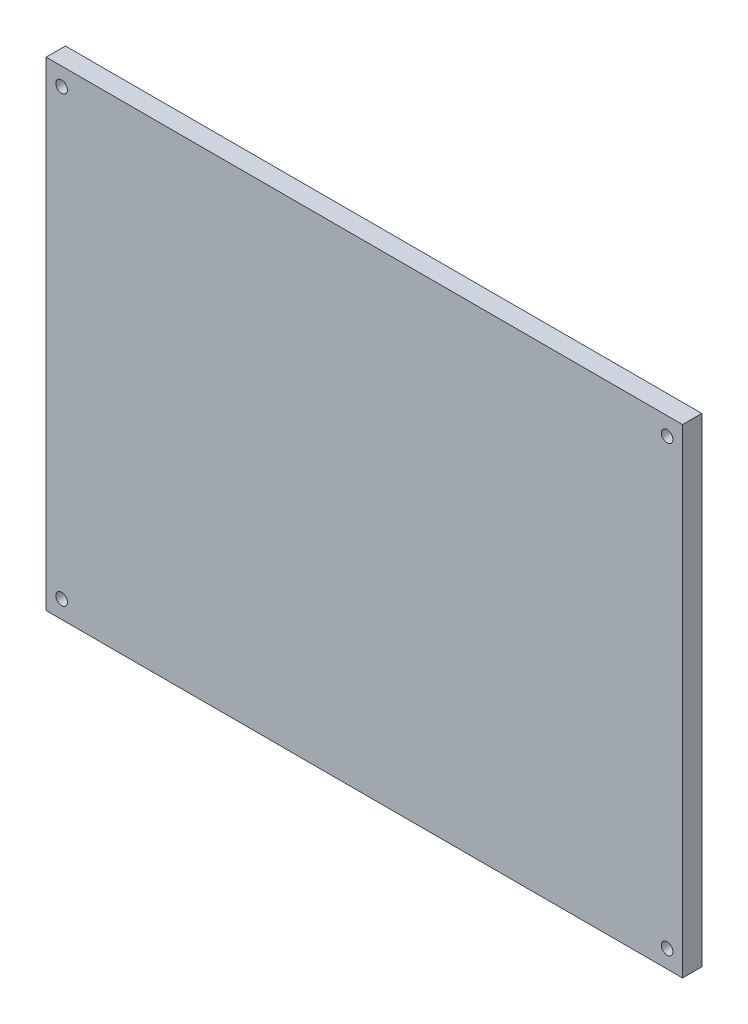
ISO-10303-21;
HEADER;
FILE_DESCRIPTION(('STEP AP214'),'2;1');
FILE_NAME('part.step','',(''),(''),'','','');
FILE_SCHEMA(('AUTOMOTIVE_DESIGN { 1 0 10303 214 1 1 1 1 }'));
ENDSEC;
DATA;
#1=APPLICATION_CONTEXT('core data for automotive mechanical design processes');
#2=APPLICATION_PROTOCOL_DEFINITION('international standard','automotive_design',2000,#1);
#3=PRODUCT_CONTEXT('',#1,'mechanical');
#4=PRODUCT('Part','Part','',(#3));
#5=PRODUCT_RELATED_PRODUCT_CATEGORY('part','',(#4));
#6=PRODUCT_DEFINITION_FORMATION('','',#4);
#7=PRODUCT_DEFINITION_CONTEXT('part definition',#1,'design');
#8=PRODUCT_DEFINITION('design','',#6,#7);
#9=PRODUCT_DEFINITION_SHAPE('','',#8);
#10=(LENGTH_UNIT() NAMED_UNIT(*) SI_UNIT(.MILLI.,.METRE.));
#11=(NAMED_UNIT(*) PLANE_ANGLE_UNIT() SI_UNIT($,.RADIAN.));
#12=(NAMED_UNIT(*) SI_UNIT($,.STERADIAN.) SOLID_ANGLE_UNIT());
#13=UNCERTAINTY_MEASURE_WITH_UNIT(LENGTH_MEASURE(1.E-05),#10,'distance_accuracy_value','');
#14=(GEOMETRIC_REPRESENTATION_CONTEXT(3) GLOBAL_UNCERTAINTY_ASSIGNED_CONTEXT((#13)) GLOBAL_UNIT_ASSIGNED_CONTEXT((#10,
#11,#12)) REPRESENTATION_CONTEXT('',''));
#15=CARTESIAN_POINT('',(0.,0.,0.));
#16=DIRECTION('',(0.,0.,1.));
#17=DIRECTION('',(1.,0.,0.));
#18=AXIS2_PLACEMENT_3D('',#15,#16,#17);
#19=CARTESIAN_POINT('',(0.,0.,0.));
#20=DIRECTION('',(0.,0.,1.));
#21=DIRECTION('',(1.,0.,0.));
#22=AXIS2_PLACEMENT_3D('',#19,#20,#21);
#23=PLANE('',#22);
#24=CARTESIAN_POINT('',(-78.45,-57.48,0.));
#25=DIRECTION('',(0.,0.,1.));
#26=DIRECTION('',(1.,0.,0.));
#27=AXIS2_PLACEMENT_3D('',#24,#25,#26);
#28=CIRCLE('',#27,1.5);
#29=CARTESIAN_POINT('',(-76.95,-57.48,0.));
#30=VERTEX_POINT('',#29);
#31=EDGE_CURVE('E364',#30,#30,#28,.F.);
#32=ORIENTED_EDGE('',*,*,#31,.F.);
#33=EDGE_LOOP('',(#32));
#34=FACE_BOUND('',#33,.T.);
#35=CARTESIAN_POINT('',(78.45,-57.48,0.));
#36=DIRECTION('',(0.,0.,1.));
#37=DIRECTION('',(1.,0.,0.));
#38=AXIS2_PLACEMENT_3D('',#35,#36,#37);
#39=CIRCLE('',#38,1.5);
#40=CARTESIAN_POINT('',(79.95,-57.48,0.));
#41=VERTEX_POINT('',#40);
#42=EDGE_CURVE('E368',#41,#41,#39,.T.);
#43=ORIENTED_EDGE('',*,*,#42,.T.);
#44=EDGE_LOOP('',(#43));
#45=FACE_BOUND('',#44,.T.);
#46=CARTESIAN_POINT('',(78.45,57.48,0.));
#47=DIRECTION('',(0.,0.,1.));
#48=DIRECTION('',(1.,0.,0.));
#49=AXIS2_PLACEMENT_3D('',#46,#47,#48);
#50=CIRCLE('',#49,1.5);
#51=CARTESIAN_POINT('',(79.95,57.48,0.));
#52=VERTEX_POINT('',#51);
#53=EDGE_CURVE('E377',#52,#52,#50,.F.);
#54=ORIENTED_EDGE('',*,*,#53,.F.);
#55=EDGE_LOOP('',(#54));
#56=FACE_BOUND('',#55,.T.);
#57=DIRECTION('',(-1.,0.,0.));
#58=VECTOR('',#57,1.);
#59=CARTESIAN_POINT('',(1.5,14.0181764613353,0.));
#60=LINE('',#59,#58);
#61=CARTESIAN_POINT('',(4.5,14.0181764613353,0.));
#62=VERTEX_POINT('',#61);
#63=CARTESIAN_POINT('',(1.5,14.0181764613353,0.));
#64=VERTEX_POINT('',#63);
#65=EDGE_CURVE('E212',#62,#64,#60,.T.);
#66=ORIENTED_EDGE('',*,*,#65,.T.);
#67=DIRECTION('',(0.,-1.,0.));
#68=VECTOR('',#67,1.);
#69=CARTESIAN_POINT('',(1.5,6.,0.));
#70=LINE('',#69,#68);
#71=CARTESIAN_POINT('',(1.5,-14.0181764613353,0.));
#72=VERTEX_POINT('',#71);
#73=EDGE_CURVE('E255',#64,#72,#70,.T.);
#74=ORIENTED_EDGE('',*,*,#73,.T.);
#75=DIRECTION('',(1.,0.,0.));
#76=VECTOR('',#75,1.);
#77=CARTESIAN_POINT('',(4.5,-14.0181764613353,0.));
#78=LINE('',#77,#76);
#79=CARTESIAN_POINT('',(4.5,-14.0181764613353,0.));
#80=VERTEX_POINT('',#79);
#81=EDGE_CURVE('E209',#72,#80,#78,.T.);
#82=ORIENTED_EDGE('',*,*,#81,.T.);
#83=DIRECTION('',(0.,-1.,0.));
#84=VECTOR('',#83,1.);
#85=CARTESIAN_POINT('',(4.5,6.,0.));
#86=LINE('',#85,#84);
#87=EDGE_CURVE('E246',#62,#80,#86,.T.);
#88=ORIENTED_EDGE('',*,*,#87,.F.);
#89=EDGE_LOOP('',(#66,#74,#82,#88));
#90=FACE_BOUND('',#89,.T.);
#91=CARTESIAN_POINT('',(-78.45,57.48,0.));
#92=DIRECTION('',(0.,0.,1.));
#93=DIRECTION('',(1.,0.,0.));
#94=AXIS2_PLACEMENT_3D('',#91,#92,#93);
#95=CIRCLE('',#94,1.5);
#96=CARTESIAN_POINT('',(-76.95,57.48,0.));
#97=VERTEX_POINT('',#96);
#98=EDGE_CURVE('E179',#97,#97,#95,.T.);
#99=ORIENTED_EDGE('',*,*,#98,.T.);
#100=EDGE_LOOP('',(#99));
#101=FACE_BOUND('',#100,.T.);
#102=DIRECTION('',(0.,1.,0.));
#103=VECTOR('',#102,1.);
#104=CARTESIAN_POINT('',(82.45,62.1,0.));
#105=LINE('',#104,#103);
#106=CARTESIAN_POINT('',(82.45,-62.1,0.));
#107=VERTEX_POINT('',#106);
#108=CARTESIAN_POINT('',(82.45,62.1,0.));
#109=VERTEX_POINT('',#108);
#110=EDGE_CURVE('E170',#107,#109,#105,.T.);
#111=ORIENTED_EDGE('',*,*,#110,.F.);
#112=DIRECTION('',(1.,0.,0.));
#113=VECTOR('',#112,1.);
#114=CARTESIAN_POINT('',(-82.45,-62.1,0.));
#115=LINE('',#114,#113);
#116=CARTESIAN_POINT('',(-82.45,-62.1,0.));
#117=VERTEX_POINT('',#116);
#118=EDGE_CURVE('E166',#117,#107,#115,.T.);
#119=ORIENTED_EDGE('',*,*,#118,.F.);
#120=DIRECTION('',(0.,-1.,0.));
#121=VECTOR('',#120,1.);
#122=CARTESIAN_POINT('',(-82.45,62.1,0.));
#123=LINE('',#122,#121);
#124=CARTESIAN_POINT('',(-82.45,62.1,0.));
#125=VERTEX_POINT('',#124);
#126=EDGE_CURVE('E277',#125,#117,#123,.T.);
#127=ORIENTED_EDGE('',*,*,#126,.F.);
#128=DIRECTION('',(-1.,0.,0.));
#129=VECTOR('',#128,1.);
#130=CARTESIAN_POINT('',(-82.45,62.1,0.));
#131=LINE('',#130,#129);
#132=EDGE_CURVE('E275',#109,#125,#131,.T.);
#133=ORIENTED_EDGE('',*,*,#132,.F.);
#134=EDGE_LOOP('',(#111,#119,#127,#133));
#135=FACE_BOUND('',#134,.T.);
#136=DIRECTION('',(1.,0.,0.));
#137=VECTOR('',#136,1.);
#138=CARTESIAN_POINT('',(-1.5,-14.0181764613353,0.));
#139=LINE('',#138,#137);
#140=CARTESIAN_POINT('',(-4.5,-14.0181764613353,0.));
#141=VERTEX_POINT('',#140);
#142=CARTESIAN_POINT('',(-1.5,-14.0181764613353,0.));
#143=VERTEX_POINT('',#142);
#144=EDGE_CURVE('E218',#141,#143,#139,.T.);
#145=ORIENTED_EDGE('',*,*,#144,.T.);
#146=DIRECTION('',(0.,-1.,0.));
#147=VECTOR('',#146,1.);
#148=CARTESIAN_POINT('',(-1.5,6.,0.));
#149=LINE('',#148,#147);
#150=CARTESIAN_POINT('',(-1.5,14.0181764613353,0.));
#151=VERTEX_POINT('',#150);
#152=EDGE_CURVE('E387',#151,#143,#149,.T.);
#153=ORIENTED_EDGE('',*,*,#152,.F.);
#154=DIRECTION('',(-1.,0.,0.));
#155=VECTOR('',#154,1.);
#156=CARTESIAN_POINT('',(-4.5,14.0181764613353,0.));
#157=LINE('',#156,#155);
#158=CARTESIAN_POINT('',(-4.5,14.0181764613353,0.));
#159=VERTEX_POINT('',#158);
#160=EDGE_CURVE('E215',#151,#159,#157,.T.);
#161=ORIENTED_EDGE('',*,*,#160,.T.);
#162=DIRECTION('',(0.,-1.,0.));
#163=VECTOR('',#162,1.);
#164=CARTESIAN_POINT('',(-4.5,6.,0.));
#165=LINE('',#164,#163);
#166=EDGE_CURVE('E384',#159,#141,#165,.T.);
#167=ORIENTED_EDGE('',*,*,#166,.T.);
#168=EDGE_LOOP('',(#145,#153,#161,#167));
#169=FACE_BOUND('',#168,.T.);
#170=ADVANCED_FACE('F34',(#34,#45,#56,#90,#101,#135,#169),#23,.F.);
#171=CARTESIAN_POINT('',(82.45,62.1,5.));
#172=DIRECTION('',(-1.,0.,0.));
#173=DIRECTION('',(0.,0.,1.));
#174=AXIS2_PLACEMENT_3D('',#171,#172,#173);
#175=PLANE('',#174);
#176=ORIENTED_EDGE('',*,*,#110,.T.);
#177=DIRECTION('',(0.,0.,-1.));
#178=VECTOR('',#177,1.);
#179=CARTESIAN_POINT('',(82.45,62.1,5.));
#180=LINE('',#179,#178);
#181=CARTESIAN_POINT('',(82.45,62.1,5.));
#182=VERTEX_POINT('',#181);
#183=EDGE_CURVE('E150',#182,#109,#180,.T.);
#184=ORIENTED_EDGE('',*,*,#183,.F.);
#185=DIRECTION('',(0.,1.,0.));
#186=VECTOR('',#185,1.);
#187=CARTESIAN_POINT('',(82.45,62.1,5.));
#188=LINE('',#187,#186);
#189=CARTESIAN_POINT('',(82.45,-62.1,5.));
#190=VERTEX_POINT('',#189);
#191=EDGE_CURVE('E157',#190,#182,#188,.T.);
#192=ORIENTED_EDGE('',*,*,#191,.F.);
#193=DIRECTION('',(0.,0.,-1.));
#194=VECTOR('',#193,1.);
#195=CARTESIAN_POINT('',(82.45,-62.1,5.));
#196=LINE('',#195,#194);
#197=EDGE_CURVE('E273',#190,#107,#196,.T.);
#198=ORIENTED_EDGE('',*,*,#197,.T.);
#199=EDGE_LOOP('',(#176,#184,#192,#198));
#200=FACE_BOUND('',#199,.T.);
#201=ADVANCED_FACE('F168',(#200),#175,.F.);
#202=CARTESIAN_POINT('',(-82.45,62.1,5.));
#203=DIRECTION('',(0.,-1.,0.));
#204=DIRECTION('',(0.,0.,-1.));
#205=AXIS2_PLACEMENT_3D('',#202,#203,#204);
#206=PLANE('',#205);
#207=ORIENTED_EDGE('',*,*,#132,.T.);
#208=DIRECTION('',(0.,0.,-1.));
#209=VECTOR('',#208,1.);
#210=CARTESIAN_POINT('',(-82.45,62.1,5.));
#211=LINE('',#210,#209);
#212=CARTESIAN_POINT('',(-82.45,62.1,5.));
#213=VERTEX_POINT('',#212);
#214=EDGE_CURVE('E153',#213,#125,#211,.T.);
#215=ORIENTED_EDGE('',*,*,#214,.F.);
#216=DIRECTION('',(-1.,0.,0.));
#217=VECTOR('',#216,1.);
#218=CARTESIAN_POINT('',(-82.45,62.1,5.));
#219=LINE('',#218,#217);
#220=EDGE_CURVE('E146',#182,#213,#219,.T.);
#221=ORIENTED_EDGE('',*,*,#220,.F.);
#222=ORIENTED_EDGE('',*,*,#183,.T.);
#223=EDGE_LOOP('',(#207,#215,#221,#222));
#224=FACE_BOUND('',#223,.T.);
#225=ADVANCED_FACE('F148',(#224),#206,.F.);
#226=CARTESIAN_POINT('',(-82.45,62.1,5.));
#227=DIRECTION('',(1.,0.,0.));
#228=DIRECTION('',(0.,0.,-1.));
#229=AXIS2_PLACEMENT_3D('',#226,#227,#228);
#230=PLANE('',#229);
#231=ORIENTED_EDGE('',*,*,#126,.T.);
#232=DIRECTION('',(0.,0.,-1.));
#233=VECTOR('',#232,1.);
#234=CARTESIAN_POINT('',(-82.45,-62.1,5.));
#235=LINE('',#234,#233);
#236=CARTESIAN_POINT('',(-82.45,-62.1,5.));
#237=VERTEX_POINT('',#236);
#238=EDGE_CURVE('E175',#237,#117,#235,.T.);
#239=ORIENTED_EDGE('',*,*,#238,.F.);
#240=DIRECTION('',(0.,-1.,0.));
#241=VECTOR('',#240,1.);
#242=CARTESIAN_POINT('',(-82.45,62.1,5.));
#243=LINE('',#242,#241);
#244=EDGE_CURVE('E156',#213,#237,#243,.T.);
#245=ORIENTED_EDGE('',*,*,#244,.F.);
#246=ORIENTED_EDGE('',*,*,#214,.T.);
#247=EDGE_LOOP('',(#231,#239,#245,#246));
#248=FACE_BOUND('',#247,.T.);
#249=ADVANCED_FACE('F289',(#248),#230,.F.);
#250=CARTESIAN_POINT('',(-82.45,-62.1,5.));
#251=DIRECTION('',(0.,1.,0.));
#252=DIRECTION('',(0.,0.,1.));
#253=AXIS2_PLACEMENT_3D('',#250,#251,#252);
#254=PLANE('',#253);
#255=ORIENTED_EDGE('',*,*,#118,.T.);
#256=ORIENTED_EDGE('',*,*,#197,.F.);
#257=DIRECTION('',(1.,0.,0.));
#258=VECTOR('',#257,1.);
#259=CARTESIAN_POINT('',(-82.45,-62.1,5.));
#260=LINE('',#259,#258);
#261=EDGE_CURVE('E162',#237,#190,#260,.T.);
#262=ORIENTED_EDGE('',*,*,#261,.F.);
#263=ORIENTED_EDGE('',*,*,#238,.T.);
#264=EDGE_LOOP('',(#255,#256,#262,#263));
#265=FACE_BOUND('',#264,.T.);
#266=ADVANCED_FACE('F284',(#265),#254,.F.);
#267=CARTESIAN_POINT('',(0.,0.,5.));
#268=DIRECTION('',(0.,0.,1.));
#269=DIRECTION('',(1.,0.,0.));
#270=AXIS2_PLACEMENT_3D('',#267,#268,#269);
#271=PLANE('',#270);
#272=CARTESIAN_POINT('',(-78.45,-57.48,5.));
#273=DIRECTION('',(0.,0.,-1.));
#274=DIRECTION('',(1.,0.,0.));
#275=AXIS2_PLACEMENT_3D('',#272,#273,#274);
#276=CIRCLE('',#275,1.5);
#277=CARTESIAN_POINT('',(-76.95,-57.48,5.));
#278=VERTEX_POINT('',#277);
#279=EDGE_CURVE('E362',#278,#278,#276,.T.);
#280=ORIENTED_EDGE('',*,*,#279,.T.);
#281=EDGE_LOOP('',(#280));
#282=FACE_BOUND('',#281,.T.);
#283=CARTESIAN_POINT('',(78.45,-57.48,5.));
#284=DIRECTION('',(0.,0.,1.));
#285=DIRECTION('',(-1.,0.,0.));
#286=AXIS2_PLACEMENT_3D('',#283,#284,#285);
#287=CIRCLE('',#286,1.5);
#288=CARTESIAN_POINT('',(76.95,-57.48,5.));
#289=VERTEX_POINT('',#288);
#290=EDGE_CURVE('E365',#289,#289,#287,.T.);
#291=ORIENTED_EDGE('',*,*,#290,.F.);
#292=EDGE_LOOP('',(#291));
#293=FACE_BOUND('',#292,.T.);
#294=CARTESIAN_POINT('',(78.45,57.48,5.));
#295=DIRECTION('',(0.,0.,-1.));
#296=DIRECTION('',(-1.,0.,0.));
#297=AXIS2_PLACEMENT_3D('',#294,#295,#296);
#298=CIRCLE('',#297,1.5);
#299=CARTESIAN_POINT('',(76.95,57.48,5.));
#300=VERTEX_POINT('',#299);
#301=EDGE_CURVE('E374',#300,#300,#298,.T.);
#302=ORIENTED_EDGE('',*,*,#301,.T.);
#303=EDGE_LOOP('',(#302));
#304=FACE_BOUND('',#303,.T.);
#305=CARTESIAN_POINT('',(-78.45,57.48,5.));
#306=DIRECTION('',(0.,0.,1.));
#307=DIRECTION('',(1.,0.,0.));
#308=AXIS2_PLACEMENT_3D('',#305,#306,#307);
#309=CIRCLE('',#308,1.5);
#310=CARTESIAN_POINT('',(-76.95,57.48,5.));
#311=VERTEX_POINT('',#310);
#312=EDGE_CURVE('E181',#311,#311,#309,.T.);
#313=ORIENTED_EDGE('',*,*,#312,.F.);
#314=EDGE_LOOP('',(#313));
#315=FACE_BOUND('',#314,.T.);
#316=ORIENTED_EDGE('',*,*,#191,.T.);
#317=ORIENTED_EDGE('',*,*,#220,.T.);
#318=ORIENTED_EDGE('',*,*,#244,.T.);
#319=ORIENTED_EDGE('',*,*,#261,.T.);
#320=EDGE_LOOP('',(#316,#317,#318,#319));
#321=FACE_BOUND('',#320,.T.);
#322=ADVANCED_FACE('F160',(#282,#293,#304,#315,#321),#271,.T.);
#323=CARTESIAN_POINT('',(-78.45,57.48,-10.));
#324=DIRECTION('',(0.,0.,1.));
#325=DIRECTION('',(1.,0.,0.));
#326=AXIS2_PLACEMENT_3D('',#323,#324,#325);
#327=CYLINDRICAL_SURFACE('',#326,1.5);
#328=ORIENTED_EDGE('',*,*,#312,.T.);
#329=EDGE_LOOP('',(#328));
#330=FACE_BOUND('',#329,.T.);
#331=ORIENTED_EDGE('',*,*,#98,.F.);
#332=EDGE_LOOP('',(#331));
#333=FACE_BOUND('',#332,.T.);
#334=ADVANCED_FACE('F310',(#330,#333),#327,.F.);
#335=CARTESIAN_POINT('',(4.5,0.,-15.));
#336=DIRECTION('',(-1.,0.,0.));
#337=DIRECTION('',(0.,0.,1.));
#338=AXIS2_PLACEMENT_3D('',#335,#336,#337);
#339=PLANE('',#338);
#340=ORIENTED_EDGE('',*,*,#87,.T.);
#341=CARTESIAN_POINT('',(4.5,-14.0181764613353,-5.));
#342=DIRECTION('',(-1.,0.,0.));
#343=DIRECTION('',(0.,0.,1.));
#344=AXIS2_PLACEMENT_3D('',#341,#342,#343);
#345=CIRCLE('',#344,5.);
#346=CARTESIAN_POINT('',(4.5,-9.19440443513233,-3.68424035659189));
#347=VERTEX_POINT('',#346);
#348=EDGE_CURVE('E42',#80,#347,#345,.T.);
#349=ORIENTED_EDGE('',*,*,#348,.T.);
#350=DIRECTION('',(0.,0.263151928681621,-0.9647544052406));
#351=VECTOR('',#350,1.);
#352=CARTESIAN_POINT('',(4.5,-5.68489078410056,-16.5506433202628));
#353=LINE('',#352,#351);
#354=CARTESIAN_POINT('',(4.5,-5.38745668080499,-17.6410813150014));
#355=VERTEX_POINT('',#354);
#356=EDGE_CURVE('E197',#347,#355,#353,.T.);
#357=ORIENTED_EDGE('',*,*,#356,.T.);
#358=CARTESIAN_POINT('',(4.5,0.,-15.));
#359=DIRECTION('',(1.,0.,0.));
#360=DIRECTION('',(0.,0.,1.));
#361=AXIS2_PLACEMENT_3D('',#358,#359,#360);
#362=CIRCLE('',#361,6.);
#363=CARTESIAN_POINT('',(4.5,5.38745668080499,-17.6410813150014));
#364=VERTEX_POINT('',#363);
#365=EDGE_CURVE('E257',#355,#364,#362,.T.);
#366=ORIENTED_EDGE('',*,*,#365,.T.);
#367=DIRECTION('',(0.,0.263151928681621,0.9647544052406));
#368=VECTOR('',#367,1.);
#369=CARTESIAN_POINT('',(4.5,5.68489078410056,-16.5506433202628));
#370=LINE('',#369,#368);
#371=CARTESIAN_POINT('',(4.5,9.19440443513233,-3.68424035659189));
#372=VERTEX_POINT('',#371);
#373=EDGE_CURVE('E206',#364,#372,#370,.T.);
#374=ORIENTED_EDGE('',*,*,#373,.T.);
#375=CARTESIAN_POINT('',(4.5,14.0181764613353,-5.));
#376=DIRECTION('',(-1.,0.,0.));
#377=DIRECTION('',(0.,0.,1.));
#378=AXIS2_PLACEMENT_3D('',#375,#376,#377);
#379=CIRCLE('',#378,5.);
#380=EDGE_CURVE('E240',#372,#62,#379,.T.);
#381=ORIENTED_EDGE('',*,*,#380,.T.);
#382=EDGE_LOOP('',(#340,#349,#357,#366,#374,#381));
#383=FACE_BOUND('',#382,.T.);
#384=CARTESIAN_POINT('',(4.5,0.,-15.));
#385=DIRECTION('',(1.,0.,0.));
#386=DIRECTION('',(0.,0.,-1.));
#387=AXIS2_PLACEMENT_3D('',#384,#385,#386);
#388=CIRCLE('',#387,2.7);
#389=CARTESIAN_POINT('',(4.5,0.,-17.7));
#390=VERTEX_POINT('',#389);
#391=EDGE_CURVE('E267',#390,#390,#388,.T.);
#392=ORIENTED_EDGE('',*,*,#391,.F.);
#393=EDGE_LOOP('',(#392));
#394=FACE_BOUND('',#393,.T.);
#395=ADVANCED_FACE('F244',(#383,#394),#339,.F.);
#396=CARTESIAN_POINT('',(1.5,0.,-15.));
#397=DIRECTION('',(-1.,0.,0.));
#398=DIRECTION('',(0.,0.,1.));
#399=AXIS2_PLACEMENT_3D('',#396,#397,#398);
#400=PLANE('',#399);
#401=ORIENTED_EDGE('',*,*,#73,.F.);
#402=CARTESIAN_POINT('',(1.5,14.0181764613353,-5.));
#403=DIRECTION('',(-1.,0.,0.));
#404=DIRECTION('',(0.,0.,1.));
#405=AXIS2_PLACEMENT_3D('',#402,#403,#404);
#406=CIRCLE('',#405,5.);
#407=CARTESIAN_POINT('',(1.5,9.19440443513233,-3.6842403565919));
#408=VERTEX_POINT('',#407);
#409=EDGE_CURVE('E238',#64,#408,#406,.F.);
#410=ORIENTED_EDGE('',*,*,#409,.T.);
#411=DIRECTION('',(0.,-0.263151928681621,-0.9647544052406));
#412=VECTOR('',#411,1.);
#413=CARTESIAN_POINT('',(1.5,10.1993389037363,0.));
#414=LINE('',#413,#412);
#415=CARTESIAN_POINT('',(1.5,5.38745668080499,-17.6410813150014));
#416=VERTEX_POINT('',#415);
#417=EDGE_CURVE('E204',#408,#416,#414,.T.);
#418=ORIENTED_EDGE('',*,*,#417,.T.);
#419=CARTESIAN_POINT('',(1.5,0.,-15.));
#420=DIRECTION('',(1.,0.,0.));
#421=DIRECTION('',(0.,0.,1.));
#422=AXIS2_PLACEMENT_3D('',#419,#420,#421);
#423=CIRCLE('',#422,6.);
#424=CARTESIAN_POINT('',(1.5,-5.38745668080499,-17.6410813150014));
#425=VERTEX_POINT('',#424);
#426=EDGE_CURVE('E258',#425,#416,#423,.T.);
#427=ORIENTED_EDGE('',*,*,#426,.F.);
#428=DIRECTION('',(0.,-0.263151928681621,0.9647544052406));
#429=VECTOR('',#428,1.);
#430=CARTESIAN_POINT('',(1.5,-5.38745668080499,-17.6410813150014));
#431=LINE('',#430,#429);
#432=CARTESIAN_POINT('',(1.5,-9.19440443513233,-3.68424035659189));
#433=VERTEX_POINT('',#432);
#434=EDGE_CURVE('E195',#425,#433,#431,.T.);
#435=ORIENTED_EDGE('',*,*,#434,.T.);
#436=CARTESIAN_POINT('',(1.5,-14.0181764613353,-5.));
#437=DIRECTION('',(-1.,0.,0.));
#438=DIRECTION('',(0.,0.,1.));
#439=AXIS2_PLACEMENT_3D('',#436,#437,#438);
#440=CIRCLE('',#439,5.);
#441=EDGE_CURVE('E11',#433,#72,#440,.F.);
#442=ORIENTED_EDGE('',*,*,#441,.T.);
#443=EDGE_LOOP('',(#401,#410,#418,#427,#435,#442));
#444=FACE_BOUND('',#443,.T.);
#445=CARTESIAN_POINT('',(1.5,0.,-15.));
#446=DIRECTION('',(1.,0.,0.));
#447=DIRECTION('',(0.,0.,-1.));
#448=AXIS2_PLACEMENT_3D('',#445,#446,#447);
#449=CIRCLE('',#448,2.7);
#450=CARTESIAN_POINT('',(1.5,0.,-17.7));
#451=VERTEX_POINT('',#450);
#452=EDGE_CURVE('E264',#451,#451,#449,.T.);
#453=ORIENTED_EDGE('',*,*,#452,.T.);
#454=EDGE_LOOP('',(#453));
#455=FACE_BOUND('',#454,.T.);
#456=ADVANCED_FACE('F319',(#444,#455),#400,.T.);
#457=CARTESIAN_POINT('',(4.5,0.,-15.));
#458=DIRECTION('',(-1.,0.,0.));
#459=DIRECTION('',(0.,0.,1.));
#460=AXIS2_PLACEMENT_3D('',#457,#458,#459);
#461=CYLINDRICAL_SURFACE('',#460,6.);
#462=ORIENTED_EDGE('',*,*,#365,.F.);
#463=DIRECTION('',(-1.,0.,0.));
#464=VECTOR('',#463,1.);
#465=CARTESIAN_POINT('',(4.5,-5.38745668080499,-17.6410813150014));
#466=LINE('',#465,#464);
#467=EDGE_CURVE('E187',#355,#425,#466,.T.);
#468=ORIENTED_EDGE('',*,*,#467,.T.);
#469=ORIENTED_EDGE('',*,*,#426,.T.);
#470=DIRECTION('',(-1.,0.,0.));
#471=VECTOR('',#470,1.);
#472=CARTESIAN_POINT('',(4.5,5.38745668080499,-17.6410813150014));
#473=LINE('',#472,#471);
#474=EDGE_CURVE('E185',#416,#364,#473,.F.);
#475=ORIENTED_EDGE('',*,*,#474,.T.);
#476=EDGE_LOOP('',(#462,#468,#469,#475));
#477=FACE_BOUND('',#476,.T.);
#478=ADVANCED_FACE('F315',(#477),#461,.T.);
#479=CARTESIAN_POINT('',(4.5,0.,-15.));
#480=DIRECTION('',(-1.,0.,0.));
#481=DIRECTION('',(0.,0.,1.));
#482=AXIS2_PLACEMENT_3D('',#479,#480,#481);
#483=CYLINDRICAL_SURFACE('',#482,2.7);
#484=ORIENTED_EDGE('',*,*,#391,.T.);
#485=EDGE_LOOP('',(#484));
#486=FACE_BOUND('',#485,.T.);
#487=ORIENTED_EDGE('',*,*,#452,.F.);
#488=EDGE_LOOP('',(#487));
#489=FACE_BOUND('',#488,.T.);
#490=ADVANCED_FACE('F318',(#486,#489),#483,.F.);
#491=CARTESIAN_POINT('',(-1.5,0.,-15.));
#492=DIRECTION('',(-1.,0.,0.));
#493=DIRECTION('',(0.,0.,1.));
#494=AXIS2_PLACEMENT_3D('',#491,#492,#493);
#495=PLANE('',#494);
#496=ORIENTED_EDGE('',*,*,#152,.T.);
#497=CARTESIAN_POINT('',(-1.5,-14.0181764613353,-5.));
#498=DIRECTION('',(-1.,0.,0.));
#499=DIRECTION('',(0.,0.,1.));
#500=AXIS2_PLACEMENT_3D('',#497,#498,#499);
#501=CIRCLE('',#500,5.);
#502=CARTESIAN_POINT('',(-1.5,-9.19440443513233,-3.68424035659189));
#503=VERTEX_POINT('',#502);
#504=EDGE_CURVE('E228',#143,#503,#501,.T.);
#505=ORIENTED_EDGE('',*,*,#504,.T.);
#506=DIRECTION('',(0.,0.263151928681621,-0.9647544052406));
#507=VECTOR('',#506,1.);
#508=CARTESIAN_POINT('',(-1.5,-5.68489078410056,-16.5506433202628));
#509=LINE('',#508,#507);
#510=CARTESIAN_POINT('',(-1.5,-5.38745668080499,-17.6410813150014));
#511=VERTEX_POINT('',#510);
#512=EDGE_CURVE('E193',#503,#511,#509,.T.);
#513=ORIENTED_EDGE('',*,*,#512,.T.);
#514=CARTESIAN_POINT('',(-1.5,0.,-15.));
#515=DIRECTION('',(1.,0.,0.));
#516=DIRECTION('',(0.,0.,1.));
#517=AXIS2_PLACEMENT_3D('',#514,#515,#516);
#518=CIRCLE('',#517,6.);
#519=CARTESIAN_POINT('',(-1.5,5.38745668080499,-17.6410813150014));
#520=VERTEX_POINT('',#519);
#521=EDGE_CURVE('E389',#511,#520,#518,.T.);
#522=ORIENTED_EDGE('',*,*,#521,.T.);
#523=DIRECTION('',(0.,0.263151928681621,0.9647544052406));
#524=VECTOR('',#523,1.);
#525=CARTESIAN_POINT('',(-1.5,5.68489078410056,-16.5506433202628));
#526=LINE('',#525,#524);
#527=CARTESIAN_POINT('',(-1.5,9.19440443513233,-3.68424035659189));
#528=VERTEX_POINT('',#527);
#529=EDGE_CURVE('E201',#520,#528,#526,.T.);
#530=ORIENTED_EDGE('',*,*,#529,.T.);
#531=CARTESIAN_POINT('',(-1.5,14.0181764613353,-5.));
#532=DIRECTION('',(-1.,0.,0.));
#533=DIRECTION('',(0.,0.,1.));
#534=AXIS2_PLACEMENT_3D('',#531,#532,#533);
#535=CIRCLE('',#534,5.);
#536=EDGE_CURVE('E235',#528,#151,#535,.T.);
#537=ORIENTED_EDGE('',*,*,#536,.T.);
#538=EDGE_LOOP('',(#496,#505,#513,#522,#530,#537));
#539=FACE_BOUND('',#538,.T.);
#540=CARTESIAN_POINT('',(-1.5,0.,-15.));
#541=DIRECTION('',(1.,0.,0.));
#542=DIRECTION('',(0.,0.,-1.));
#543=AXIS2_PLACEMENT_3D('',#540,#541,#542);
#544=CIRCLE('',#543,2.7);
#545=CARTESIAN_POINT('',(-1.5,0.,-17.7));
#546=VERTEX_POINT('',#545);
#547=EDGE_CURVE('E381',#546,#546,#544,.T.);
#548=ORIENTED_EDGE('',*,*,#547,.F.);
#549=EDGE_LOOP('',(#548));
#550=FACE_BOUND('',#549,.T.);
#551=ADVANCED_FACE('F328',(#539,#550),#495,.F.);
#552=CARTESIAN_POINT('',(-4.5,0.,-15.));
#553=DIRECTION('',(-1.,0.,0.));
#554=DIRECTION('',(0.,0.,1.));
#555=AXIS2_PLACEMENT_3D('',#552,#553,#554);
#556=PLANE('',#555);
#557=ORIENTED_EDGE('',*,*,#166,.F.);
#558=CARTESIAN_POINT('',(-4.5,14.0181764613353,-5.));
#559=DIRECTION('',(-1.,0.,0.));
#560=DIRECTION('',(0.,0.,1.));
#561=AXIS2_PLACEMENT_3D('',#558,#559,#560);
#562=CIRCLE('',#561,5.);
#563=CARTESIAN_POINT('',(-4.5,9.19440443513233,-3.6842403565919));
#564=VERTEX_POINT('',#563);
#565=EDGE_CURVE('E233',#159,#564,#562,.F.);
#566=ORIENTED_EDGE('',*,*,#565,.T.);
#567=DIRECTION('',(0.,-0.263151928681621,-0.9647544052406));
#568=VECTOR('',#567,1.);
#569=CARTESIAN_POINT('',(-4.5,10.1993389037363,0.));
#570=LINE('',#569,#568);
#571=CARTESIAN_POINT('',(-4.5,5.38745668080499,-17.6410813150014));
#572=VERTEX_POINT('',#571);
#573=EDGE_CURVE('E199',#564,#572,#570,.T.);
#574=ORIENTED_EDGE('',*,*,#573,.T.);
#575=CARTESIAN_POINT('',(-4.5,0.,-15.));
#576=DIRECTION('',(1.,0.,0.));
#577=DIRECTION('',(0.,0.,1.));
#578=AXIS2_PLACEMENT_3D('',#575,#576,#577);
#579=CIRCLE('',#578,6.);
#580=CARTESIAN_POINT('',(-4.5,-5.38745668080499,-17.6410813150014));
#581=VERTEX_POINT('',#580);
#582=EDGE_CURVE('E390',#581,#572,#579,.T.);
#583=ORIENTED_EDGE('',*,*,#582,.F.);
#584=DIRECTION('',(0.,-0.263151928681621,0.9647544052406));
#585=VECTOR('',#584,1.);
#586=CARTESIAN_POINT('',(-4.5,-5.38745668080499,-17.6410813150014));
#587=LINE('',#586,#585);
#588=CARTESIAN_POINT('',(-4.5,-9.19440443513233,-3.68424035659189));
#589=VERTEX_POINT('',#588);
#590=EDGE_CURVE('E190',#581,#589,#587,.T.);
#591=ORIENTED_EDGE('',*,*,#590,.T.);
#592=CARTESIAN_POINT('',(-4.5,-14.0181764613353,-5.));
#593=DIRECTION('',(-1.,0.,0.));
#594=DIRECTION('',(0.,0.,1.));
#595=AXIS2_PLACEMENT_3D('',#592,#593,#594);
#596=CIRCLE('',#595,5.);
#597=EDGE_CURVE('E230',#589,#141,#596,.F.);
#598=ORIENTED_EDGE('',*,*,#597,.T.);
#599=EDGE_LOOP('',(#557,#566,#574,#583,#591,#598));
#600=FACE_BOUND('',#599,.T.);
#601=CARTESIAN_POINT('',(-4.5,0.,-15.));
#602=DIRECTION('',(1.,0.,0.));
#603=DIRECTION('',(0.,0.,-1.));
#604=AXIS2_PLACEMENT_3D('',#601,#602,#603);
#605=CIRCLE('',#604,2.7);
#606=CARTESIAN_POINT('',(-4.5,0.,-17.7));
#607=VERTEX_POINT('',#606);
#608=EDGE_CURVE('E380',#607,#607,#605,.T.);
#609=ORIENTED_EDGE('',*,*,#608,.T.);
#610=EDGE_LOOP('',(#609));
#611=FACE_BOUND('',#610,.T.);
#612=ADVANCED_FACE('F334',(#600,#611),#556,.T.);
#613=CARTESIAN_POINT('',(-1.5,0.,-15.));
#614=DIRECTION('',(-1.,0.,0.));
#615=DIRECTION('',(0.,0.,1.));
#616=AXIS2_PLACEMENT_3D('',#613,#614,#615);
#617=CYLINDRICAL_SURFACE('',#616,6.);
#618=ORIENTED_EDGE('',*,*,#521,.F.);
#619=DIRECTION('',(-1.,0.,0.));
#620=VECTOR('',#619,1.);
#621=CARTESIAN_POINT('',(-1.5,-5.38745668080499,-17.6410813150014));
#622=LINE('',#621,#620);
#623=EDGE_CURVE('E173',#511,#581,#622,.T.);
#624=ORIENTED_EDGE('',*,*,#623,.T.);
#625=ORIENTED_EDGE('',*,*,#582,.T.);
#626=DIRECTION('',(-1.,0.,0.));
#627=VECTOR('',#626,1.);
#628=CARTESIAN_POINT('',(-1.5,5.38745668080499,-17.6410813150014));
#629=LINE('',#628,#627);
#630=EDGE_CURVE('E171',#572,#520,#629,.F.);
#631=ORIENTED_EDGE('',*,*,#630,.T.);
#632=EDGE_LOOP('',(#618,#624,#625,#631));
#633=FACE_BOUND('',#632,.T.);
#634=ADVANCED_FACE('F330',(#633),#617,.T.);
#635=CARTESIAN_POINT('',(-1.5,0.,-15.));
#636=DIRECTION('',(-1.,0.,0.));
#637=DIRECTION('',(0.,0.,1.));
#638=AXIS2_PLACEMENT_3D('',#635,#636,#637);
#639=CYLINDRICAL_SURFACE('',#638,2.7);
#640=ORIENTED_EDGE('',*,*,#547,.T.);
#641=EDGE_LOOP('',(#640));
#642=FACE_BOUND('',#641,.T.);
#643=ORIENTED_EDGE('',*,*,#608,.F.);
#644=EDGE_LOOP('',(#643));
#645=FACE_BOUND('',#644,.T.);
#646=ADVANCED_FACE('F333',(#642,#645),#639,.F.);
#647=CARTESIAN_POINT('',(-1.5,-5.38745668080499,-17.6410813150014));
#648=DIRECTION('',(0.,0.9647544052406,0.263151928681621));
#649=DIRECTION('',(-1.,0.,0.));
#650=AXIS2_PLACEMENT_3D('',#647,#648,#649);
#651=PLANE('',#650);
#652=ORIENTED_EDGE('',*,*,#512,.F.);
#653=DIRECTION('',(1.,0.,0.));
#654=VECTOR('',#653,1.);
#655=CARTESIAN_POINT('',(-4.5,-9.19440443513233,-3.6842403565919));
#656=LINE('',#655,#654);
#657=EDGE_CURVE('E221',#503,#589,#656,.F.);
#658=ORIENTED_EDGE('',*,*,#657,.T.);
#659=ORIENTED_EDGE('',*,*,#590,.F.);
#660=ORIENTED_EDGE('',*,*,#623,.F.);
#661=EDGE_LOOP('',(#652,#658,#659,#660));
#662=FACE_BOUND('',#661,.T.);
#663=ADVANCED_FACE('F344',(#662),#651,.F.);
#664=CARTESIAN_POINT('',(4.5,-5.38745668080499,-17.6410813150014));
#665=DIRECTION('',(0.,0.9647544052406,0.263151928681621));
#666=DIRECTION('',(-1.,0.,0.));
#667=AXIS2_PLACEMENT_3D('',#664,#665,#666);
#668=PLANE('',#667);
#669=ORIENTED_EDGE('',*,*,#356,.F.);
#670=DIRECTION('',(1.,0.,0.));
#671=VECTOR('',#670,1.);
#672=CARTESIAN_POINT('',(1.5,-9.19440443513233,-3.6842403565919));
#673=LINE('',#672,#671);
#674=EDGE_CURVE('E49',#347,#433,#673,.F.);
#675=ORIENTED_EDGE('',*,*,#674,.T.);
#676=ORIENTED_EDGE('',*,*,#434,.F.);
#677=ORIENTED_EDGE('',*,*,#467,.F.);
#678=EDGE_LOOP('',(#669,#675,#676,#677));
#679=FACE_BOUND('',#678,.T.);
#680=ADVANCED_FACE('F428',(#679),#668,.F.);
#681=CARTESIAN_POINT('',(-1.5,10.1993389037363,0.));
#682=DIRECTION('',(0.,-0.9647544052406,0.263151928681621));
#683=DIRECTION('',(-1.,0.,0.));
#684=AXIS2_PLACEMENT_3D('',#681,#682,#683);
#685=PLANE('',#684);
#686=ORIENTED_EDGE('',*,*,#573,.F.);
#687=DIRECTION('',(-1.,0.,0.));
#688=VECTOR('',#687,1.);
#689=CARTESIAN_POINT('',(-1.5,9.19440443513233,-3.6842403565919));
#690=LINE('',#689,#688);
#691=EDGE_CURVE('E223',#564,#528,#690,.F.);
#692=ORIENTED_EDGE('',*,*,#691,.T.);
#693=ORIENTED_EDGE('',*,*,#529,.F.);
#694=ORIENTED_EDGE('',*,*,#630,.F.);
#695=EDGE_LOOP('',(#686,#692,#693,#694));
#696=FACE_BOUND('',#695,.T.);
#697=ADVANCED_FACE('F408',(#696),#685,.F.);
#698=CARTESIAN_POINT('',(4.5,10.1993389037363,0.));
#699=DIRECTION('',(0.,-0.9647544052406,0.263151928681621));
#700=DIRECTION('',(-1.,0.,0.));
#701=AXIS2_PLACEMENT_3D('',#698,#699,#700);
#702=PLANE('',#701);
#703=ORIENTED_EDGE('',*,*,#417,.F.);
#704=DIRECTION('',(-1.,0.,0.));
#705=VECTOR('',#704,1.);
#706=CARTESIAN_POINT('',(4.5,9.19440443513233,-3.6842403565919));
#707=LINE('',#706,#705);
#708=EDGE_CURVE('E225',#408,#372,#707,.F.);
#709=ORIENTED_EDGE('',*,*,#708,.T.);
#710=ORIENTED_EDGE('',*,*,#373,.F.);
#711=ORIENTED_EDGE('',*,*,#474,.F.);
#712=EDGE_LOOP('',(#703,#709,#710,#711));
#713=FACE_BOUND('',#712,.T.);
#714=ADVANCED_FACE('F447',(#713),#702,.F.);
#715=CARTESIAN_POINT('',(0.,-14.0181764613353,-5.));
#716=DIRECTION('',(-1.,0.,0.));
#717=DIRECTION('',(0.,0.,1.));
#718=AXIS2_PLACEMENT_3D('',#715,#716,#717);
#719=CYLINDRICAL_SURFACE('',#718,5.);
#720=ORIENTED_EDGE('',*,*,#597,.F.);
#721=ORIENTED_EDGE('',*,*,#657,.F.);
#722=ORIENTED_EDGE('',*,*,#504,.F.);
#723=ORIENTED_EDGE('',*,*,#144,.F.);
#724=EDGE_LOOP('',(#720,#721,#722,#723));
#725=FACE_BOUND('',#724,.T.);
#726=ADVANCED_FACE('F422',(#725),#719,.F.);
#727=CARTESIAN_POINT('',(0.,14.0181764613353,-5.));
#728=DIRECTION('',(1.,0.,0.));
#729=DIRECTION('',(0.,0.,-1.));
#730=AXIS2_PLACEMENT_3D('',#727,#728,#729);
#731=CYLINDRICAL_SURFACE('',#730,5.);
#732=ORIENTED_EDGE('',*,*,#536,.F.);
#733=ORIENTED_EDGE('',*,*,#691,.F.);
#734=ORIENTED_EDGE('',*,*,#565,.F.);
#735=ORIENTED_EDGE('',*,*,#160,.F.);
#736=EDGE_LOOP('',(#732,#733,#734,#735));
#737=FACE_BOUND('',#736,.T.);
#738=ADVANCED_FACE('F414',(#737),#731,.F.);
#739=CARTESIAN_POINT('',(0.,14.0181764613353,-5.));
#740=DIRECTION('',(1.,0.,0.));
#741=DIRECTION('',(0.,0.,-1.));
#742=AXIS2_PLACEMENT_3D('',#739,#740,#741);
#743=CYLINDRICAL_SURFACE('',#742,5.);
#744=ORIENTED_EDGE('',*,*,#380,.F.);
#745=ORIENTED_EDGE('',*,*,#708,.F.);
#746=ORIENTED_EDGE('',*,*,#409,.F.);
#747=ORIENTED_EDGE('',*,*,#65,.F.);
#748=EDGE_LOOP('',(#744,#745,#746,#747));
#749=FACE_BOUND('',#748,.T.);
#750=ADVANCED_FACE('F252',(#749),#743,.F.);
#751=CARTESIAN_POINT('',(0.,-14.0181764613353,-5.));
#752=DIRECTION('',(-1.,0.,0.));
#753=DIRECTION('',(0.,0.,1.));
#754=AXIS2_PLACEMENT_3D('',#751,#752,#753);
#755=CYLINDRICAL_SURFACE('',#754,5.);
#756=ORIENTED_EDGE('',*,*,#441,.F.);
#757=ORIENTED_EDGE('',*,*,#674,.F.);
#758=ORIENTED_EDGE('',*,*,#348,.F.);
#759=ORIENTED_EDGE('',*,*,#81,.F.);
#760=EDGE_LOOP('',(#756,#757,#758,#759));
#761=FACE_BOUND('',#760,.T.);
#762=ADVANCED_FACE('F36',(#761),#755,.F.);
#763=CARTESIAN_POINT('',(78.45,57.48,-10.));
#764=DIRECTION('',(0.,0.,1.));
#765=DIRECTION('',(1.,0.,0.));
#766=AXIS2_PLACEMENT_3D('',#763,#764,#765);
#767=CYLINDRICAL_SURFACE('',#766,1.5);
#768=ORIENTED_EDGE('',*,*,#301,.F.);
#769=EDGE_LOOP('',(#768));
#770=FACE_BOUND('',#769,.T.);
#771=ORIENTED_EDGE('',*,*,#53,.T.);
#772=EDGE_LOOP('',(#771));
#773=FACE_BOUND('',#772,.T.);
#774=ADVANCED_FACE('F346',(#770,#773),#767,.F.);
#775=CARTESIAN_POINT('',(78.45,-57.48,-10.));
#776=DIRECTION('',(0.,0.,1.));
#777=DIRECTION('',(1.,0.,0.));
#778=AXIS2_PLACEMENT_3D('',#775,#776,#777);
#779=CYLINDRICAL_SURFACE('',#778,1.5);
#780=ORIENTED_EDGE('',*,*,#290,.T.);
#781=EDGE_LOOP('',(#780));
#782=FACE_BOUND('',#781,.T.);
#783=ORIENTED_EDGE('',*,*,#42,.F.);
#784=EDGE_LOOP('',(#783));
#785=FACE_BOUND('',#784,.T.);
#786=ADVANCED_FACE('F349',(#782,#785),#779,.F.);
#787=CARTESIAN_POINT('',(-78.45,-57.48,-10.));
#788=DIRECTION('',(0.,0.,1.));
#789=DIRECTION('',(1.,0.,0.));
#790=AXIS2_PLACEMENT_3D('',#787,#788,#789);
#791=CYLINDRICAL_SURFACE('',#790,1.5);
#792=ORIENTED_EDGE('',*,*,#279,.F.);
#793=EDGE_LOOP('',(#792));
#794=FACE_BOUND('',#793,.T.);
#795=ORIENTED_EDGE('',*,*,#31,.T.);
#796=EDGE_LOOP('',(#795));
#797=FACE_BOUND('',#796,.T.);
#798=ADVANCED_FACE('F353',(#794,#797),#791,.F.);
#799=CLOSED_SHELL('',(#170,#201,#225,#249,#266,#322,#334,#395,#456,#478,#490,#551,#612,#634,
#646,#663,#680,#697,#714,#726,#738,#750,#762,#774,#786,#798));
#800=MANIFOLD_SOLID_BREP('B2',#799);
#801=ADVANCED_BREP_SHAPE_REPRESENTATION('',(#18,#800),#14);
#802=SHAPE_DEFINITION_REPRESENTATION(#9,#801);
ENDSEC;
END-ISO-10303-21;
